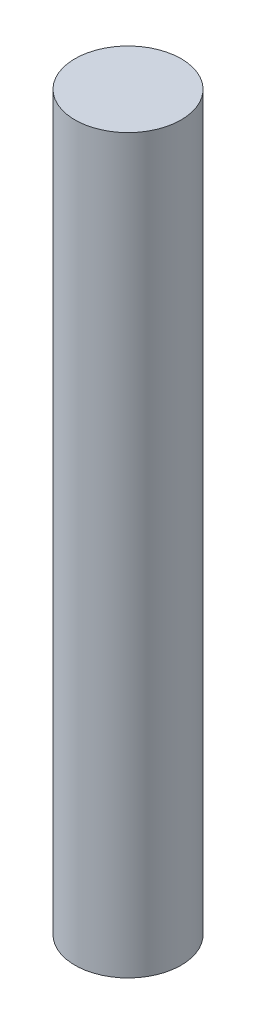
ISO-10303-21;
HEADER;
FILE_DESCRIPTION(('STEP AP214'),'2;1');
FILE_NAME('part.step','',(''),(''),'','','');
FILE_SCHEMA(('AUTOMOTIVE_DESIGN { 1 0 10303 214 1 1 1 1 }'));
ENDSEC;
DATA;
#1=APPLICATION_CONTEXT('core data for automotive mechanical design processes');
#2=APPLICATION_PROTOCOL_DEFINITION('international standard','automotive_design',2000,#1);
#3=PRODUCT_CONTEXT('',#1,'mechanical');
#4=PRODUCT('Part','Part','',(#3));
#5=PRODUCT_RELATED_PRODUCT_CATEGORY('part','',(#4));
#6=PRODUCT_DEFINITION_FORMATION('','',#4);
#7=PRODUCT_DEFINITION_CONTEXT('part definition',#1,'design');
#8=PRODUCT_DEFINITION('design','',#6,#7);
#9=PRODUCT_DEFINITION_SHAPE('','',#8);
#10=(LENGTH_UNIT() NAMED_UNIT(*) SI_UNIT(.MILLI.,.METRE.));
#11=(NAMED_UNIT(*) PLANE_ANGLE_UNIT() SI_UNIT($,.RADIAN.));
#12=(NAMED_UNIT(*) SI_UNIT($,.STERADIAN.) SOLID_ANGLE_UNIT());
#13=UNCERTAINTY_MEASURE_WITH_UNIT(LENGTH_MEASURE(1.E-05),#10,'distance_accuracy_value','');
#14=(GEOMETRIC_REPRESENTATION_CONTEXT(3) GLOBAL_UNCERTAINTY_ASSIGNED_CONTEXT((#13)) GLOBAL_UNIT_ASSIGNED_CONTEXT((#10,
#11,#12)) REPRESENTATION_CONTEXT('',''));
#15=CARTESIAN_POINT('',(0.,0.,0.));
#16=DIRECTION('',(0.,0.,1.));
#17=DIRECTION('',(1.,0.,0.));
#18=AXIS2_PLACEMENT_3D('',#15,#16,#17);
#19=CARTESIAN_POINT('',(0.,25.4,0.));
#20=DIRECTION('',(0.,-1.,0.));
#21=DIRECTION('',(0.,0.,-1.));
#22=AXIS2_PLACEMENT_3D('',#19,#20,#21);
#23=CYLINDRICAL_SURFACE('',#22,1.8415);
#24=CARTESIAN_POINT('',(0.,25.4,0.));
#25=DIRECTION('',(0.,1.,0.));
#26=DIRECTION('',(0.,0.,1.));
#27=AXIS2_PLACEMENT_3D('',#24,#25,#26);
#28=CIRCLE('',#27,1.8415);
#29=CARTESIAN_POINT('',(0.,25.4,-1.8415));
#30=VERTEX_POINT('',#29);
#31=EDGE_CURVE('E10',#30,#30,#28,.T.);
#32=CARTESIAN_POINT('',(0.,0.,0.));
#33=DIRECTION('',(0.,1.,0.));
#34=DIRECTION('',(0.,0.,1.));
#35=AXIS2_PLACEMENT_3D('',#32,#33,#34);
#36=CIRCLE('',#35,1.8415);
#37=CARTESIAN_POINT('',(0.,0.,-1.8415));
#38=VERTEX_POINT('',#37);
#39=EDGE_CURVE('E34',#38,#38,#36,.T.);
#40=CARTESIAN_POINT('',(0.,25.4,-1.8415));
#41=CARTESIAN_POINT('',(0.,25.1354166666667,-1.8415));
#42=CARTESIAN_POINT('',(0.,24.8708333333333,-1.8415));
#43=CARTESIAN_POINT('',(0.,24.3416666666667,-1.8415));
#44=CARTESIAN_POINT('',(0.,24.0770833333333,-1.8415));
#45=CARTESIAN_POINT('',(0.,23.5479166666667,-1.8415));
#46=CARTESIAN_POINT('',(0.,23.2833333333333,-1.8415));
#47=CARTESIAN_POINT('',(0.,22.7541666666667,-1.8415));
#48=CARTESIAN_POINT('',(0.,22.4895833333333,-1.8415));
#49=CARTESIAN_POINT('',(0.,21.9604166666667,-1.8415));
#50=CARTESIAN_POINT('',(0.,21.6958333333333,-1.8415));
#51=CARTESIAN_POINT('',(0.,21.1666666666667,-1.8415));
#52=CARTESIAN_POINT('',(0.,20.9020833333333,-1.8415));
#53=CARTESIAN_POINT('',(0.,20.3729166666667,-1.8415));
#54=CARTESIAN_POINT('',(0.,20.1083333333333,-1.8415));
#55=CARTESIAN_POINT('',(0.,19.5791666666667,-1.8415));
#56=CARTESIAN_POINT('',(0.,19.3145833333333,-1.8415));
#57=CARTESIAN_POINT('',(0.,18.7854166666667,-1.8415));
#58=CARTESIAN_POINT('',(0.,18.5208333333333,-1.8415));
#59=CARTESIAN_POINT('',(0.,17.9916666666667,-1.8415));
#60=CARTESIAN_POINT('',(0.,17.7270833333333,-1.8415));
#61=CARTESIAN_POINT('',(0.,17.1979166666667,-1.8415));
#62=CARTESIAN_POINT('',(0.,16.9333333333333,-1.8415));
#63=CARTESIAN_POINT('',(0.,16.4041666666667,-1.8415));
#64=CARTESIAN_POINT('',(0.,16.1395833333333,-1.8415));
#65=CARTESIAN_POINT('',(0.,15.6104166666667,-1.8415));
#66=CARTESIAN_POINT('',(0.,15.3458333333333,-1.8415));
#67=CARTESIAN_POINT('',(0.,14.8166666666667,-1.8415));
#68=CARTESIAN_POINT('',(0.,14.5520833333333,-1.8415));
#69=CARTESIAN_POINT('',(0.,14.0229166666667,-1.8415));
#70=CARTESIAN_POINT('',(0.,13.7583333333333,-1.8415));
#71=CARTESIAN_POINT('',(0.,13.2291666666667,-1.8415));
#72=CARTESIAN_POINT('',(0.,12.9645833333333,-1.8415));
#73=CARTESIAN_POINT('',(0.,12.4354166666667,-1.8415));
#74=CARTESIAN_POINT('',(0.,12.1708333333333,-1.8415));
#75=CARTESIAN_POINT('',(0.,11.6416666666667,-1.8415));
#76=CARTESIAN_POINT('',(0.,11.3770833333333,-1.8415));
#77=CARTESIAN_POINT('',(0.,10.8479166666667,-1.8415));
#78=CARTESIAN_POINT('',(0.,10.5833333333333,-1.8415));
#79=CARTESIAN_POINT('',(0.,10.0541666666667,-1.8415));
#80=CARTESIAN_POINT('',(0.,9.78958333333333,-1.8415));
#81=CARTESIAN_POINT('',(0.,9.26041666666667,-1.8415));
#82=CARTESIAN_POINT('',(0.,8.99583333333334,-1.8415));
#83=CARTESIAN_POINT('',(0.,8.46666666666667,-1.8415));
#84=CARTESIAN_POINT('',(0.,8.20208333333333,-1.8415));
#85=CARTESIAN_POINT('',(0.,7.67291666666667,-1.8415));
#86=CARTESIAN_POINT('',(0.,7.40833333333333,-1.8415));
#87=CARTESIAN_POINT('',(0.,6.87916666666667,-1.8415));
#88=CARTESIAN_POINT('',(0.,6.61458333333333,-1.8415));
#89=CARTESIAN_POINT('',(0.,6.08541666666667,-1.8415));
#90=CARTESIAN_POINT('',(0.,5.82083333333333,-1.8415));
#91=CARTESIAN_POINT('',(0.,5.29166666666667,-1.8415));
#92=CARTESIAN_POINT('',(0.,5.02708333333334,-1.8415));
#93=CARTESIAN_POINT('',(0.,4.49791666666667,-1.8415));
#94=CARTESIAN_POINT('',(0.,4.23333333333333,-1.8415));
#95=CARTESIAN_POINT('',(0.,3.70416666666667,-1.8415));
#96=CARTESIAN_POINT('',(0.,3.43958333333333,-1.8415));
#97=CARTESIAN_POINT('',(0.,2.91041666666667,-1.8415));
#98=CARTESIAN_POINT('',(0.,2.64583333333333,-1.8415));
#99=CARTESIAN_POINT('',(0.,2.11666666666667,-1.8415));
#100=CARTESIAN_POINT('',(0.,1.85208333333333,-1.8415));
#101=CARTESIAN_POINT('',(0.,1.32291666666667,-1.8415));
#102=CARTESIAN_POINT('',(0.,1.05833333333333,-1.8415));
#103=CARTESIAN_POINT('',(0.,0.529166666666666,-1.8415));
#104=CARTESIAN_POINT('',(0.,0.264583333333333,-1.8415));
#105=CARTESIAN_POINT('',(0.,0.,-1.8415));
#106=B_SPLINE_CURVE_WITH_KNOTS('',3,(#40,#41,#42,#43,#44,#45,#46,#47,#48,#49,#50,#51,#52,#53,
#54,#55,#56,#57,#58,#59,#60,#61,#62,#63,#64,#65,#66,#67,#68,#69,#70,#71,#72,#73,#74,#75,#76,#77,
#78,#79,#80,#81,#82,#83,#84,#85,#86,#87,#88,#89,#90,#91,#92,#93,#94,#95,#96,#97,#98,#99,#100,
#101,#102,#103,#104,#105),.UNSPECIFIED.,.F.,.F.,(4,2,2,2,2,2,2,2,2,2,2,2,2,2,2,2,2,2,2,2,2,2,2,
2,2,2,2,2,2,2,2,2,4),(0.,0.793750000000003,1.5875,2.38125,3.175,3.96875,4.7625,5.55625,6.35,
7.14375,7.9375,8.73125,9.525,10.31875,11.1125,11.90625,12.7,13.49375,14.2875,15.08125,15.875,
16.66875,17.4625,18.25625,19.05,19.84375,20.6375,21.43125,22.225,23.01875,23.8125,24.60625,
25.4),.UNSPECIFIED.);
#107=EDGE_CURVE('BSEAM31',#30,#38,#106,.T.);
#108=ORIENTED_EDGE('',*,*,#31,.F.);
#109=ORIENTED_EDGE('',*,*,#39,.T.);
#110=ORIENTED_EDGE('',*,*,#107,.T.);
#111=ORIENTED_EDGE('',*,*,#107,.F.);
#112=EDGE_LOOP('',(#108,#110,#109,#111));
#113=FACE_BOUND('',#112,.T.);
#114=ADVANCED_FACE('F31',(#113),#23,.T.);
#115=CARTESIAN_POINT('',(0.,25.4,0.));
#116=DIRECTION('',(0.,1.,0.));
#117=DIRECTION('',(0.,0.,1.));
#118=AXIS2_PLACEMENT_3D('',#115,#116,#117);
#119=PLANE('',#118);
#120=ORIENTED_EDGE('',*,*,#31,.T.);
#121=EDGE_LOOP('',(#120));
#122=FACE_BOUND('',#121,.T.);
#123=ADVANCED_FACE('F46',(#122),#119,.T.);
#124=CARTESIAN_POINT('',(0.,0.,0.));
#125=DIRECTION('',(0.,1.,0.));
#126=DIRECTION('',(0.,0.,1.));
#127=AXIS2_PLACEMENT_3D('',#124,#125,#126);
#128=PLANE('',#127);
#129=ORIENTED_EDGE('',*,*,#39,.F.);
#130=EDGE_LOOP('',(#129));
#131=FACE_BOUND('',#130,.T.);
#132=ADVANCED_FACE('F44',(#131),#128,.F.);
#133=CLOSED_SHELL('',(#114,#123,#132));
#134=MANIFOLD_SOLID_BREP('B2',#133);
#135=ADVANCED_BREP_SHAPE_REPRESENTATION('',(#18,#134),#14);
#136=SHAPE_DEFINITION_REPRESENTATION(#9,#135);
ENDSEC;
END-ISO-10303-21;
